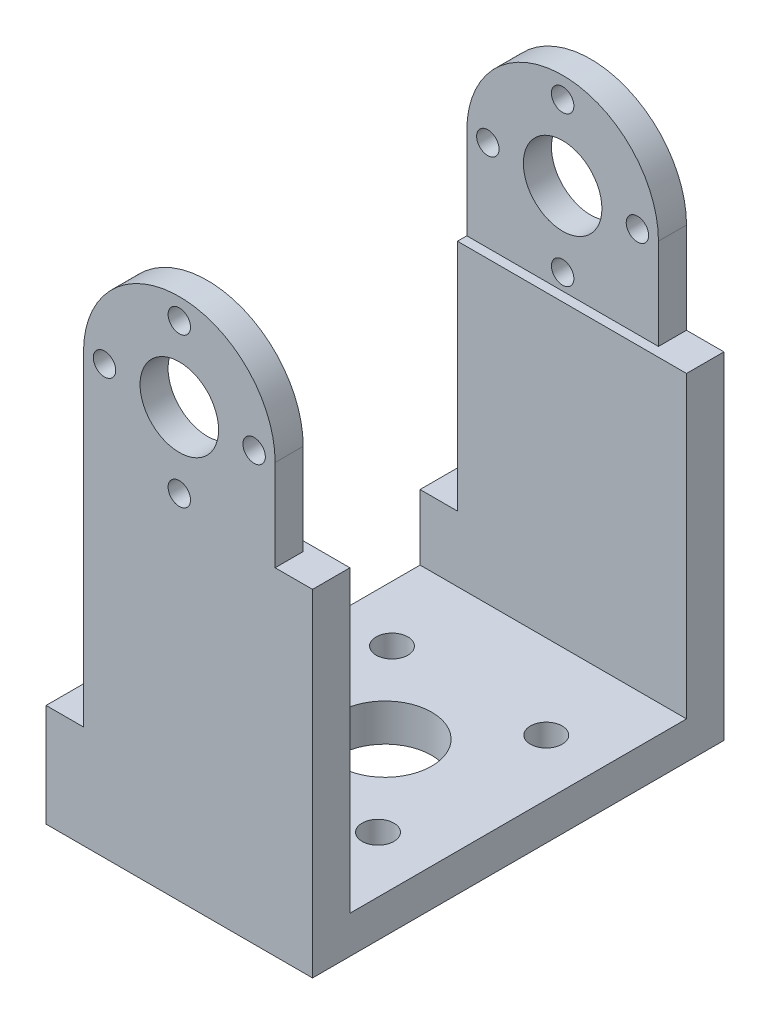
ISO-10303-21;
HEADER;
FILE_DESCRIPTION(('STEP AP214'),'2;1');
FILE_NAME('part.step','',(''),(''),'','','');
FILE_SCHEMA(('AUTOMOTIVE_DESIGN { 1 0 10303 214 1 1 1 1 }'));
ENDSEC;
DATA;
#1=APPLICATION_CONTEXT('core data for automotive mechanical design processes');
#2=APPLICATION_PROTOCOL_DEFINITION('international standard','automotive_design',2000,#1);
#3=PRODUCT_CONTEXT('',#1,'mechanical');
#4=PRODUCT('Part','Part','',(#3));
#5=PRODUCT_RELATED_PRODUCT_CATEGORY('part','',(#4));
#6=PRODUCT_DEFINITION_FORMATION('','',#4);
#7=PRODUCT_DEFINITION_CONTEXT('part definition',#1,'design');
#8=PRODUCT_DEFINITION('design','',#6,#7);
#9=PRODUCT_DEFINITION_SHAPE('','',#8);
#10=(LENGTH_UNIT() NAMED_UNIT(*) SI_UNIT(.MILLI.,.METRE.));
#11=(NAMED_UNIT(*) PLANE_ANGLE_UNIT() SI_UNIT($,.RADIAN.));
#12=(NAMED_UNIT(*) SI_UNIT($,.STERADIAN.) SOLID_ANGLE_UNIT());
#13=UNCERTAINTY_MEASURE_WITH_UNIT(LENGTH_MEASURE(1.E-05),#10,'distance_accuracy_value','');
#14=(GEOMETRIC_REPRESENTATION_CONTEXT(3) GLOBAL_UNCERTAINTY_ASSIGNED_CONTEXT((#13)) GLOBAL_UNIT_ASSIGNED_CONTEXT((#10,
#11,#12)) REPRESENTATION_CONTEXT('',''));
#15=CARTESIAN_POINT('',(0.,0.,0.));
#16=DIRECTION('',(0.,0.,1.));
#17=DIRECTION('',(1.,0.,0.));
#18=AXIS2_PLACEMENT_3D('',#15,#16,#17);
#19=CARTESIAN_POINT('',(10.25,-9.75,-19.));
#20=DIRECTION('',(0.,-1.,0.));
#21=DIRECTION('',(0.,0.,-1.));
#22=AXIS2_PLACEMENT_3D('',#19,#20,#21);
#23=PLANE('',#22);
#24=DIRECTION('',(0.,0.,-1.));
#25=VECTOR('',#24,1.);
#26=CARTESIAN_POINT('',(-10.25,-9.75,22.));
#27=LINE('',#26,#25);
#28=CARTESIAN_POINT('',(-10.25,-9.75000000000001,-18.));
#29=VERTEX_POINT('',#28);
#30=CARTESIAN_POINT('',(-10.25,-9.75,-19.));
#31=VERTEX_POINT('',#30);
#32=EDGE_CURVE('E218',#29,#31,#27,.T.);
#33=ORIENTED_EDGE('',*,*,#32,.F.);
#34=DIRECTION('',(-1.,0.,0.));
#35=VECTOR('',#34,1.);
#36=CARTESIAN_POINT('',(14.25,-9.75000000000001,-18.));
#37=LINE('',#36,#35);
#38=CARTESIAN_POINT('',(14.25,-9.75000000000001,-18.));
#39=VERTEX_POINT('',#38);
#40=EDGE_CURVE('E195',#39,#29,#37,.T.);
#41=ORIENTED_EDGE('',*,*,#40,.F.);
#42=DIRECTION('',(0.,0.,-1.));
#43=VECTOR('',#42,1.);
#44=CARTESIAN_POINT('',(14.25,-9.75,22.));
#45=LINE('',#44,#43);
#46=CARTESIAN_POINT('',(14.25,-9.75,-22.));
#47=VERTEX_POINT('',#46);
#48=EDGE_CURVE('E239',#39,#47,#45,.T.);
#49=ORIENTED_EDGE('',*,*,#48,.T.);
#50=DIRECTION('',(-1.,0.,0.));
#51=VECTOR('',#50,1.);
#52=CARTESIAN_POINT('',(10.25,-9.75,-22.));
#53=LINE('',#52,#51);
#54=CARTESIAN_POINT('',(10.25,-9.75,-22.));
#55=VERTEX_POINT('',#54);
#56=EDGE_CURVE('E182',#47,#55,#53,.T.);
#57=ORIENTED_EDGE('',*,*,#56,.T.);
#58=DIRECTION('',(0.,0.,1.));
#59=VECTOR('',#58,1.);
#60=CARTESIAN_POINT('',(10.25,-9.75,-22.));
#61=LINE('',#60,#59);
#62=CARTESIAN_POINT('',(10.25,-9.75,-19.));
#63=VERTEX_POINT('',#62);
#64=EDGE_CURVE('E448',#55,#63,#61,.T.);
#65=ORIENTED_EDGE('',*,*,#64,.T.);
#66=DIRECTION('',(-1.,0.,0.));
#67=VECTOR('',#66,1.);
#68=CARTESIAN_POINT('',(10.25,-9.75,-19.));
#69=LINE('',#68,#67);
#70=EDGE_CURVE('E405',#63,#31,#69,.T.);
#71=ORIENTED_EDGE('',*,*,#70,.T.);
#72=EDGE_LOOP('',(#33,#41,#49,#57,#65,#71));
#73=FACE_BOUND('',#72,.T.);
#74=ADVANCED_FACE('F47',(#73),#23,.F.);
#75=CARTESIAN_POINT('',(0.,-45.75,0.));
#76=DIRECTION('',(0.,-1.,0.));
#77=DIRECTION('',(0.,0.,-1.));
#78=AXIS2_PLACEMENT_3D('',#75,#76,#77);
#79=PLANE('',#78);
#80=DIRECTION('',(0.,0.,-1.));
#81=VECTOR('',#80,1.);
#82=CARTESIAN_POINT('',(14.25,-45.75,0.));
#83=LINE('',#82,#81);
#84=CARTESIAN_POINT('',(14.25,-45.75,22.));
#85=VERTEX_POINT('',#84);
#86=CARTESIAN_POINT('',(14.25,-45.75,-22.));
#87=VERTEX_POINT('',#86);
#88=EDGE_CURVE('E378',#85,#87,#83,.T.);
#89=ORIENTED_EDGE('',*,*,#88,.F.);
#90=DIRECTION('',(1.,0.,0.));
#91=VECTOR('',#90,1.);
#92=CARTESIAN_POINT('',(-10.25,-45.75,22.));
#93=LINE('',#92,#91);
#94=CARTESIAN_POINT('',(-14.25,-45.75,22.));
#95=VERTEX_POINT('',#94);
#96=EDGE_CURVE('E261',#95,#85,#93,.T.);
#97=ORIENTED_EDGE('',*,*,#96,.F.);
#98=DIRECTION('',(0.,0.,-1.));
#99=VECTOR('',#98,1.);
#100=CARTESIAN_POINT('',(-14.25,-45.75,0.));
#101=LINE('',#100,#99);
#102=CARTESIAN_POINT('',(-14.25,-45.75,-22.));
#103=VERTEX_POINT('',#102);
#104=EDGE_CURVE('E341',#95,#103,#101,.T.);
#105=ORIENTED_EDGE('',*,*,#104,.T.);
#106=DIRECTION('',(-1.,0.,0.));
#107=VECTOR('',#106,1.);
#108=CARTESIAN_POINT('',(10.25,-45.75,-22.));
#109=LINE('',#108,#107);
#110=EDGE_CURVE('E399',#87,#103,#109,.T.);
#111=ORIENTED_EDGE('',*,*,#110,.F.);
#112=EDGE_LOOP('',(#89,#97,#105,#111));
#113=FACE_BOUND('',#112,.T.);
#114=CARTESIAN_POINT('',(-8.24999999999981,-45.75,-8.99999999999999));
#115=DIRECTION('',(0.,-1.,0.));
#116=DIRECTION('',(0.,0.,-1.));
#117=AXIS2_PLACEMENT_3D('',#114,#115,#116);
#118=CIRCLE('',#117,1.7);
#119=CARTESIAN_POINT('',(-8.24999999999981,-45.75,-10.7));
#120=VERTEX_POINT('',#119);
#121=EDGE_CURVE('E330',#120,#120,#118,.T.);
#122=ORIENTED_EDGE('',*,*,#121,.F.);
#123=EDGE_LOOP('',(#122));
#124=FACE_BOUND('',#123,.T.);
#125=CARTESIAN_POINT('',(8.2500000000002,-45.75,-8.99999999999999));
#126=DIRECTION('',(0.,-1.,0.));
#127=DIRECTION('',(0.,0.,-1.));
#128=AXIS2_PLACEMENT_3D('',#125,#126,#127);
#129=CIRCLE('',#128,1.7);
#130=CARTESIAN_POINT('',(8.2500000000002,-45.75,-10.7));
#131=VERTEX_POINT('',#130);
#132=EDGE_CURVE('E362',#131,#131,#129,.T.);
#133=ORIENTED_EDGE('',*,*,#132,.F.);
#134=EDGE_LOOP('',(#133));
#135=FACE_BOUND('',#134,.T.);
#136=CARTESIAN_POINT('',(8.25000000000001,-45.75,9.00000000000001));
#137=DIRECTION('',(0.,-1.,0.));
#138=DIRECTION('',(0.,0.,-1.));
#139=AXIS2_PLACEMENT_3D('',#136,#137,#138);
#140=CIRCLE('',#139,1.7);
#141=CARTESIAN_POINT('',(8.25000000000001,-45.75,7.30000000000001));
#142=VERTEX_POINT('',#141);
#143=EDGE_CURVE('E366',#142,#142,#140,.T.);
#144=ORIENTED_EDGE('',*,*,#143,.F.);
#145=EDGE_LOOP('',(#144));
#146=FACE_BOUND('',#145,.T.);
#147=CARTESIAN_POINT('',(-8.24999999999999,-45.75,9.00000000000001));
#148=DIRECTION('',(0.,-1.,0.));
#149=DIRECTION('',(0.,0.,-1.));
#150=AXIS2_PLACEMENT_3D('',#147,#148,#149);
#151=CIRCLE('',#150,1.7);
#152=CARTESIAN_POINT('',(-8.24999999999999,-45.75,7.30000000000001));
#153=VERTEX_POINT('',#152);
#154=EDGE_CURVE('E370',#153,#153,#151,.T.);
#155=ORIENTED_EDGE('',*,*,#154,.F.);
#156=EDGE_LOOP('',(#155));
#157=FACE_BOUND('',#156,.T.);
#158=CARTESIAN_POINT('',(0.,-45.75,0.));
#159=DIRECTION('',(0.,-1.,0.));
#160=DIRECTION('',(0.,0.,-1.));
#161=AXIS2_PLACEMENT_3D('',#158,#159,#160);
#162=CIRCLE('',#161,5.);
#163=CARTESIAN_POINT('',(0.,-45.75,-5.));
#164=VERTEX_POINT('',#163);
#165=EDGE_CURVE('E374',#164,#164,#162,.T.);
#166=ORIENTED_EDGE('',*,*,#165,.F.);
#167=EDGE_LOOP('',(#166));
#168=FACE_BOUND('',#167,.T.);
#169=ADVANCED_FACE('F49',(#113,#124,#135,#146,#157,#168),#79,.T.);
#170=CARTESIAN_POINT('',(-10.25,0.,-22.));
#171=DIRECTION('',(-1.,0.,0.));
#172=DIRECTION('',(0.,0.,1.));
#173=AXIS2_PLACEMENT_3D('',#170,#171,#172);
#174=PLANE('',#173);
#175=DIRECTION('',(0.,-1.,0.));
#176=VECTOR('',#175,1.);
#177=CARTESIAN_POINT('',(-10.25,0.,-18.));
#178=LINE('',#177,#176);
#179=CARTESIAN_POINT('',(-10.25,-34.75,-18.));
#180=VERTEX_POINT('',#179);
#181=EDGE_CURVE('E70',#29,#180,#178,.T.);
#182=ORIENTED_EDGE('',*,*,#181,.F.);
#183=ORIENTED_EDGE('',*,*,#32,.T.);
#184=DIRECTION('',(0.,-1.,0.));
#185=VECTOR('',#184,1.);
#186=CARTESIAN_POINT('',(-10.25,10.25,-19.));
#187=LINE('',#186,#185);
#188=CARTESIAN_POINT('',(-10.25,0.,-19.));
#189=VERTEX_POINT('',#188);
#190=EDGE_CURVE('E429',#189,#31,#187,.T.);
#191=ORIENTED_EDGE('',*,*,#190,.F.);
#192=DIRECTION('',(0.,0.,1.));
#193=VECTOR('',#192,1.);
#194=CARTESIAN_POINT('',(-10.25,0.,-22.));
#195=LINE('',#194,#193);
#196=CARTESIAN_POINT('',(-10.25,0.,-22.));
#197=VERTEX_POINT('',#196);
#198=EDGE_CURVE('E409',#197,#189,#195,.T.);
#199=ORIENTED_EDGE('',*,*,#198,.F.);
#200=DIRECTION('',(0.,-1.,0.));
#201=VECTOR('',#200,1.);
#202=CARTESIAN_POINT('',(-10.25,0.,-22.));
#203=LINE('',#202,#201);
#204=CARTESIAN_POINT('',(-10.25,-34.75,-22.));
#205=VERTEX_POINT('',#204);
#206=EDGE_CURVE('E400',#197,#205,#203,.T.);
#207=ORIENTED_EDGE('',*,*,#206,.T.);
#208=DIRECTION('',(0.,0.,-1.));
#209=VECTOR('',#208,1.);
#210=CARTESIAN_POINT('',(-10.25,-34.75,22.));
#211=LINE('',#210,#209);
#212=EDGE_CURVE('E230',#180,#205,#211,.T.);
#213=ORIENTED_EDGE('',*,*,#212,.F.);
#214=EDGE_LOOP('',(#182,#183,#191,#199,#207,#213));
#215=FACE_BOUND('',#214,.T.);
#216=ADVANCED_FACE('F473',(#215),#174,.T.);
#217=CARTESIAN_POINT('',(0.,0.,-22.));
#218=DIRECTION('',(0.,0.,1.));
#219=DIRECTION('',(1.,0.,0.));
#220=AXIS2_PLACEMENT_3D('',#217,#218,#219);
#221=CYLINDRICAL_SURFACE('',#220,10.25);
#222=CARTESIAN_POINT('',(0.,0.,-19.));
#223=DIRECTION('',(0.,0.,-1.));
#224=DIRECTION('',(-1.,0.,0.));
#225=AXIS2_PLACEMENT_3D('',#222,#223,#224);
#226=CIRCLE('',#225,10.25);
#227=CARTESIAN_POINT('',(10.25,0.,-19.));
#228=VERTEX_POINT('',#227);
#229=EDGE_CURVE('E394',#228,#189,#226,.F.);
#230=ORIENTED_EDGE('',*,*,#229,.F.);
#231=DIRECTION('',(0.,0.,1.));
#232=VECTOR('',#231,1.);
#233=CARTESIAN_POINT('',(10.25,0.,-22.));
#234=LINE('',#233,#232);
#235=CARTESIAN_POINT('',(10.25,0.,-22.));
#236=VERTEX_POINT('',#235);
#237=EDGE_CURVE('E426',#236,#228,#234,.T.);
#238=ORIENTED_EDGE('',*,*,#237,.F.);
#239=CARTESIAN_POINT('',(0.,0.,-22.));
#240=DIRECTION('',(0.,0.,1.));
#241=DIRECTION('',(1.,0.,0.));
#242=AXIS2_PLACEMENT_3D('',#239,#240,#241);
#243=CIRCLE('',#242,10.25);
#244=EDGE_CURVE('E404',#236,#197,#243,.T.);
#245=ORIENTED_EDGE('',*,*,#244,.T.);
#246=ORIENTED_EDGE('',*,*,#198,.T.);
#247=EDGE_LOOP('',(#230,#238,#245,#246));
#248=FACE_BOUND('',#247,.T.);
#249=ADVANCED_FACE('F537',(#248),#221,.T.);
#250=CARTESIAN_POINT('',(0.,0.,-22.));
#251=DIRECTION('',(0.,0.,1.));
#252=DIRECTION('',(1.,0.,0.));
#253=AXIS2_PLACEMENT_3D('',#250,#251,#252);
#254=CYLINDRICAL_SURFACE('',#253,4.2);
#255=CARTESIAN_POINT('',(0.,0.,-19.));
#256=DIRECTION('',(0.,0.,-1.));
#257=DIRECTION('',(-1.,0.,0.));
#258=AXIS2_PLACEMENT_3D('',#255,#256,#257);
#259=CIRCLE('',#258,4.2);
#260=CARTESIAN_POINT('',(-4.2,0.,-19.));
#261=VERTEX_POINT('',#260);
#262=EDGE_CURVE('E430',#261,#261,#259,.F.);
#263=ORIENTED_EDGE('',*,*,#262,.T.);
#264=EDGE_LOOP('',(#263));
#265=FACE_BOUND('',#264,.T.);
#266=CARTESIAN_POINT('',(0.,0.,-22.));
#267=DIRECTION('',(0.,0.,1.));
#268=DIRECTION('',(1.,0.,0.));
#269=AXIS2_PLACEMENT_3D('',#266,#267,#268);
#270=CIRCLE('',#269,4.2);
#271=CARTESIAN_POINT('',(4.2,0.,-22.));
#272=VERTEX_POINT('',#271);
#273=EDGE_CURVE('E410',#272,#272,#270,.T.);
#274=ORIENTED_EDGE('',*,*,#273,.F.);
#275=EDGE_LOOP('',(#274));
#276=FACE_BOUND('',#275,.T.);
#277=ADVANCED_FACE('F568',(#265,#276),#254,.F.);
#278=CARTESIAN_POINT('',(8.,0.,-22.));
#279=DIRECTION('',(0.,0.,1.));
#280=DIRECTION('',(1.,0.,0.));
#281=AXIS2_PLACEMENT_3D('',#278,#279,#280);
#282=CYLINDRICAL_SURFACE('',#281,1.2);
#283=CARTESIAN_POINT('',(8.,0.,-19.));
#284=DIRECTION('',(0.,0.,-1.));
#285=DIRECTION('',(-1.,0.,0.));
#286=AXIS2_PLACEMENT_3D('',#283,#284,#285);
#287=CIRCLE('',#286,1.2);
#288=CARTESIAN_POINT('',(6.8,0.,-19.));
#289=VERTEX_POINT('',#288);
#290=EDGE_CURVE('E434',#289,#289,#287,.F.);
#291=ORIENTED_EDGE('',*,*,#290,.T.);
#292=EDGE_LOOP('',(#291));
#293=FACE_BOUND('',#292,.T.);
#294=CARTESIAN_POINT('',(8.,0.,-22.));
#295=DIRECTION('',(0.,0.,1.));
#296=DIRECTION('',(1.,0.,0.));
#297=AXIS2_PLACEMENT_3D('',#294,#295,#296);
#298=CIRCLE('',#297,1.2);
#299=CARTESIAN_POINT('',(9.2,0.,-22.));
#300=VERTEX_POINT('',#299);
#301=EDGE_CURVE('E414',#300,#300,#298,.T.);
#302=ORIENTED_EDGE('',*,*,#301,.F.);
#303=EDGE_LOOP('',(#302));
#304=FACE_BOUND('',#303,.T.);
#305=ADVANCED_FACE('F577',(#293,#304),#282,.F.);
#306=CARTESIAN_POINT('',(0.,8.,-22.));
#307=DIRECTION('',(0.,0.,1.));
#308=DIRECTION('',(1.,0.,0.));
#309=AXIS2_PLACEMENT_3D('',#306,#307,#308);
#310=CYLINDRICAL_SURFACE('',#309,1.2);
#311=CARTESIAN_POINT('',(0.,8.,-19.));
#312=DIRECTION('',(0.,0.,-1.));
#313=DIRECTION('',(-1.,0.,0.));
#314=AXIS2_PLACEMENT_3D('',#311,#312,#313);
#315=CIRCLE('',#314,1.2);
#316=CARTESIAN_POINT('',(-1.2,8.,-19.));
#317=VERTEX_POINT('',#316);
#318=EDGE_CURVE('E438',#317,#317,#315,.F.);
#319=ORIENTED_EDGE('',*,*,#318,.T.);
#320=EDGE_LOOP('',(#319));
#321=FACE_BOUND('',#320,.T.);
#322=CARTESIAN_POINT('',(0.,8.,-22.));
#323=DIRECTION('',(0.,0.,1.));
#324=DIRECTION('',(1.,0.,0.));
#325=AXIS2_PLACEMENT_3D('',#322,#323,#324);
#326=CIRCLE('',#325,1.2);
#327=CARTESIAN_POINT('',(1.2,8.,-22.));
#328=VERTEX_POINT('',#327);
#329=EDGE_CURVE('E418',#328,#328,#326,.T.);
#330=ORIENTED_EDGE('',*,*,#329,.F.);
#331=EDGE_LOOP('',(#330));
#332=FACE_BOUND('',#331,.T.);
#333=ADVANCED_FACE('F573',(#321,#332),#310,.F.);
#334=CARTESIAN_POINT('',(-8.,0.,-22.));
#335=DIRECTION('',(0.,0.,1.));
#336=DIRECTION('',(1.,0.,0.));
#337=AXIS2_PLACEMENT_3D('',#334,#335,#336);
#338=CYLINDRICAL_SURFACE('',#337,1.2);
#339=CARTESIAN_POINT('',(-8.,0.,-19.));
#340=DIRECTION('',(0.,0.,-1.));
#341=DIRECTION('',(-1.,0.,0.));
#342=AXIS2_PLACEMENT_3D('',#339,#340,#341);
#343=CIRCLE('',#342,1.2);
#344=CARTESIAN_POINT('',(-9.2,0.,-19.));
#345=VERTEX_POINT('',#344);
#346=EDGE_CURVE('E389',#345,#345,#343,.F.);
#347=ORIENTED_EDGE('',*,*,#346,.T.);
#348=EDGE_LOOP('',(#347));
#349=FACE_BOUND('',#348,.T.);
#350=CARTESIAN_POINT('',(-8.,0.,-22.));
#351=DIRECTION('',(0.,0.,1.));
#352=DIRECTION('',(1.,0.,0.));
#353=AXIS2_PLACEMENT_3D('',#350,#351,#352);
#354=CIRCLE('',#353,1.2);
#355=CARTESIAN_POINT('',(-6.8,0.,-22.));
#356=VERTEX_POINT('',#355);
#357=EDGE_CURVE('E422',#356,#356,#354,.T.);
#358=ORIENTED_EDGE('',*,*,#357,.F.);
#359=EDGE_LOOP('',(#358));
#360=FACE_BOUND('',#359,.T.);
#361=ADVANCED_FACE('F570',(#349,#360),#338,.F.);
#362=CARTESIAN_POINT('',(0.,-8.,-22.));
#363=DIRECTION('',(0.,0.,1.));
#364=DIRECTION('',(1.,0.,0.));
#365=AXIS2_PLACEMENT_3D('',#362,#363,#364);
#366=CYLINDRICAL_SURFACE('',#365,1.2);
#367=CARTESIAN_POINT('',(0.,-8.,-19.));
#368=DIRECTION('',(0.,0.,-1.));
#369=DIRECTION('',(-1.,0.,0.));
#370=AXIS2_PLACEMENT_3D('',#367,#368,#369);
#371=CIRCLE('',#370,1.2);
#372=CARTESIAN_POINT('',(-1.20000000000006,-8.,-19.));
#373=VERTEX_POINT('',#372);
#374=EDGE_CURVE('E384',#373,#373,#371,.F.);
#375=ORIENTED_EDGE('',*,*,#374,.T.);
#376=EDGE_LOOP('',(#375));
#377=FACE_BOUND('',#376,.T.);
#378=CARTESIAN_POINT('',(0.,-8.,-22.));
#379=DIRECTION('',(0.,0.,1.));
#380=DIRECTION('',(1.,0.,0.));
#381=AXIS2_PLACEMENT_3D('',#378,#379,#380);
#382=CIRCLE('',#381,1.2);
#383=CARTESIAN_POINT('',(1.19999999999994,-8.,-22.));
#384=VERTEX_POINT('',#383);
#385=EDGE_CURVE('E390',#384,#384,#382,.T.);
#386=ORIENTED_EDGE('',*,*,#385,.F.);
#387=EDGE_LOOP('',(#386));
#388=FACE_BOUND('',#387,.T.);
#389=ADVANCED_FACE('F565',(#377,#388),#366,.F.);
#390=CARTESIAN_POINT('',(10.25,0.,-22.));
#391=DIRECTION('',(-1.,0.,0.));
#392=DIRECTION('',(0.,0.,1.));
#393=AXIS2_PLACEMENT_3D('',#390,#391,#392);
#394=PLANE('',#393);
#395=DIRECTION('',(0.,-1.,0.));
#396=VECTOR('',#395,1.);
#397=CARTESIAN_POINT('',(10.25,10.25,-19.));
#398=LINE('',#397,#396);
#399=EDGE_CURVE('E388',#228,#63,#398,.T.);
#400=ORIENTED_EDGE('',*,*,#399,.T.);
#401=ORIENTED_EDGE('',*,*,#64,.F.);
#402=DIRECTION('',(0.,-1.,0.));
#403=VECTOR('',#402,1.);
#404=CARTESIAN_POINT('',(10.25,0.,-22.));
#405=LINE('',#404,#403);
#406=EDGE_CURVE('E395',#236,#55,#405,.T.);
#407=ORIENTED_EDGE('',*,*,#406,.F.);
#408=ORIENTED_EDGE('',*,*,#237,.T.);
#409=EDGE_LOOP('',(#400,#401,#407,#408));
#410=FACE_BOUND('',#409,.T.);
#411=ADVANCED_FACE('F530',(#410),#394,.F.);
#412=CARTESIAN_POINT('',(0.,0.,-22.));
#413=DIRECTION('',(0.,0.,1.));
#414=DIRECTION('',(1.,0.,0.));
#415=AXIS2_PLACEMENT_3D('',#412,#413,#414);
#416=PLANE('',#415);
#417=ORIENTED_EDGE('',*,*,#357,.T.);
#418=EDGE_LOOP('',(#417));
#419=FACE_BOUND('',#418,.T.);
#420=ORIENTED_EDGE('',*,*,#329,.T.);
#421=EDGE_LOOP('',(#420));
#422=FACE_BOUND('',#421,.T.);
#423=ORIENTED_EDGE('',*,*,#301,.T.);
#424=EDGE_LOOP('',(#423));
#425=FACE_BOUND('',#424,.T.);
#426=ORIENTED_EDGE('',*,*,#273,.T.);
#427=EDGE_LOOP('',(#426));
#428=FACE_BOUND('',#427,.T.);
#429=DIRECTION('',(0.,-1.,0.));
#430=VECTOR('',#429,1.);
#431=CARTESIAN_POINT('',(-14.25,-9.75,-22.));
#432=LINE('',#431,#430);
#433=CARTESIAN_POINT('',(-14.25,-34.75,-22.));
#434=VERTEX_POINT('',#433);
#435=EDGE_CURVE('E244',#434,#103,#432,.T.);
#436=ORIENTED_EDGE('',*,*,#435,.F.);
#437=DIRECTION('',(-1.,0.,0.));
#438=VECTOR('',#437,1.);
#439=CARTESIAN_POINT('',(-10.25,-34.75,-22.));
#440=LINE('',#439,#438);
#441=EDGE_CURVE('E213',#205,#434,#440,.T.);
#442=ORIENTED_EDGE('',*,*,#441,.F.);
#443=ORIENTED_EDGE('',*,*,#206,.F.);
#444=ORIENTED_EDGE('',*,*,#244,.F.);
#445=ORIENTED_EDGE('',*,*,#406,.T.);
#446=ORIENTED_EDGE('',*,*,#56,.F.);
#447=DIRECTION('',(0.,1.,0.));
#448=VECTOR('',#447,1.);
#449=CARTESIAN_POINT('',(14.25,-9.75,-22.));
#450=LINE('',#449,#448);
#451=EDGE_CURVE('E240',#87,#47,#450,.T.);
#452=ORIENTED_EDGE('',*,*,#451,.F.);
#453=ORIENTED_EDGE('',*,*,#110,.T.);
#454=EDGE_LOOP('',(#436,#442,#443,#444,#445,#446,#452,#453));
#455=FACE_BOUND('',#454,.T.);
#456=ORIENTED_EDGE('',*,*,#385,.T.);
#457=EDGE_LOOP('',(#456));
#458=FACE_BOUND('',#457,.T.);
#459=ADVANCED_FACE('F522',(#419,#422,#425,#428,#455,#458),#416,.F.);
#460=CARTESIAN_POINT('',(10.25,10.25,-19.));
#461=DIRECTION('',(0.,0.,-1.));
#462=DIRECTION('',(-1.,0.,0.));
#463=AXIS2_PLACEMENT_3D('',#460,#461,#462);
#464=PLANE('',#463);
#465=ORIENTED_EDGE('',*,*,#229,.T.);
#466=ORIENTED_EDGE('',*,*,#190,.T.);
#467=ORIENTED_EDGE('',*,*,#70,.F.);
#468=ORIENTED_EDGE('',*,*,#399,.F.);
#469=EDGE_LOOP('',(#465,#466,#467,#468));
#470=FACE_BOUND('',#469,.T.);
#471=ORIENTED_EDGE('',*,*,#290,.F.);
#472=EDGE_LOOP('',(#471));
#473=FACE_BOUND('',#472,.T.);
#474=ORIENTED_EDGE('',*,*,#346,.F.);
#475=EDGE_LOOP('',(#474));
#476=FACE_BOUND('',#475,.T.);
#477=ORIENTED_EDGE('',*,*,#374,.F.);
#478=EDGE_LOOP('',(#477));
#479=FACE_BOUND('',#478,.T.);
#480=ORIENTED_EDGE('',*,*,#318,.F.);
#481=EDGE_LOOP('',(#480));
#482=FACE_BOUND('',#481,.T.);
#483=ORIENTED_EDGE('',*,*,#262,.F.);
#484=EDGE_LOOP('',(#483));
#485=FACE_BOUND('',#484,.T.);
#486=ADVANCED_FACE('F533',(#470,#473,#476,#479,#482,#485),#464,.F.);
#487=CARTESIAN_POINT('',(14.25,-41.75,0.));
#488=DIRECTION('',(-1.,0.,0.));
#489=DIRECTION('',(0.,0.,1.));
#490=AXIS2_PLACEMENT_3D('',#487,#488,#489);
#491=PLANE('',#490);
#492=DIRECTION('',(0.,0.,-1.));
#493=VECTOR('',#492,1.);
#494=CARTESIAN_POINT('',(14.25,-41.75,0.));
#495=LINE('',#494,#493);
#496=CARTESIAN_POINT('',(14.25,-41.75,18.));
#497=VERTEX_POINT('',#496);
#498=CARTESIAN_POINT('',(14.25,-41.75,-18.));
#499=VERTEX_POINT('',#498);
#500=EDGE_CURVE('E183',#497,#499,#495,.T.);
#501=ORIENTED_EDGE('',*,*,#500,.F.);
#502=DIRECTION('',(0.,1.,0.));
#503=VECTOR('',#502,1.);
#504=CARTESIAN_POINT('',(14.25,-9.75,18.));
#505=LINE('',#504,#503);
#506=CARTESIAN_POINT('',(14.25,-9.75,18.));
#507=VERTEX_POINT('',#506);
#508=EDGE_CURVE('E190',#497,#507,#505,.T.);
#509=ORIENTED_EDGE('',*,*,#508,.T.);
#510=CARTESIAN_POINT('',(14.25,-9.75,22.));
#511=VERTEX_POINT('',#510);
#512=EDGE_CURVE('E245',#511,#507,#45,.T.);
#513=ORIENTED_EDGE('',*,*,#512,.F.);
#514=DIRECTION('',(0.,1.,0.));
#515=VECTOR('',#514,1.);
#516=CARTESIAN_POINT('',(14.25,-9.75,22.));
#517=LINE('',#516,#515);
#518=EDGE_CURVE('E235',#85,#511,#517,.T.);
#519=ORIENTED_EDGE('',*,*,#518,.F.);
#520=ORIENTED_EDGE('',*,*,#88,.T.);
#521=ORIENTED_EDGE('',*,*,#451,.T.);
#522=ORIENTED_EDGE('',*,*,#48,.F.);
#523=DIRECTION('',(0.,-1.,0.));
#524=VECTOR('',#523,1.);
#525=CARTESIAN_POINT('',(14.25,-9.75000000000001,-18.));
#526=LINE('',#525,#524);
#527=EDGE_CURVE('E207',#39,#499,#526,.T.);
#528=ORIENTED_EDGE('',*,*,#527,.T.);
#529=EDGE_LOOP('',(#501,#509,#513,#519,#520,#521,#522,#528));
#530=FACE_BOUND('',#529,.T.);
#531=ADVANCED_FACE('F509',(#530),#491,.F.);
#532=CARTESIAN_POINT('',(-14.25,-41.75,0.));
#533=DIRECTION('',(-1.,0.,0.));
#534=DIRECTION('',(0.,0.,1.));
#535=AXIS2_PLACEMENT_3D('',#532,#533,#534);
#536=PLANE('',#535);
#537=DIRECTION('',(0.,1.,0.));
#538=VECTOR('',#537,1.);
#539=CARTESIAN_POINT('',(-14.25,-9.75,18.));
#540=LINE('',#539,#538);
#541=CARTESIAN_POINT('',(-14.25,-41.75,18.));
#542=VERTEX_POINT('',#541);
#543=CARTESIAN_POINT('',(-14.25,-34.75,18.));
#544=VERTEX_POINT('',#543);
#545=EDGE_CURVE('E63',#542,#544,#540,.T.);
#546=ORIENTED_EDGE('',*,*,#545,.F.);
#547=DIRECTION('',(0.,0.,-1.));
#548=VECTOR('',#547,1.);
#549=CARTESIAN_POINT('',(-14.25,-41.75,0.));
#550=LINE('',#549,#548);
#551=CARTESIAN_POINT('',(-14.25,-41.75,-18.));
#552=VERTEX_POINT('',#551);
#553=EDGE_CURVE('E172',#542,#552,#550,.T.);
#554=ORIENTED_EDGE('',*,*,#553,.T.);
#555=DIRECTION('',(0.,-1.,0.));
#556=VECTOR('',#555,1.);
#557=CARTESIAN_POINT('',(-14.25,-9.75000000000001,-18.));
#558=LINE('',#557,#556);
#559=CARTESIAN_POINT('',(-14.25,-34.75,-18.));
#560=VERTEX_POINT('',#559);
#561=EDGE_CURVE('E175',#560,#552,#558,.T.);
#562=ORIENTED_EDGE('',*,*,#561,.F.);
#563=DIRECTION('',(0.,0.,-1.));
#564=VECTOR('',#563,1.);
#565=CARTESIAN_POINT('',(-14.25,-34.75,22.));
#566=LINE('',#565,#564);
#567=EDGE_CURVE('E229',#560,#434,#566,.T.);
#568=ORIENTED_EDGE('',*,*,#567,.T.);
#569=ORIENTED_EDGE('',*,*,#435,.T.);
#570=ORIENTED_EDGE('',*,*,#104,.F.);
#571=DIRECTION('',(0.,-1.,0.));
#572=VECTOR('',#571,1.);
#573=CARTESIAN_POINT('',(-14.25,-9.75,22.));
#574=LINE('',#573,#572);
#575=CARTESIAN_POINT('',(-14.25,-34.75,22.));
#576=VERTEX_POINT('',#575);
#577=EDGE_CURVE('E234',#576,#95,#574,.T.);
#578=ORIENTED_EDGE('',*,*,#577,.F.);
#579=EDGE_CURVE('E231',#576,#544,#566,.T.);
#580=ORIENTED_EDGE('',*,*,#579,.T.);
#581=EDGE_LOOP('',(#546,#554,#562,#568,#569,#570,#578,#580));
#582=FACE_BOUND('',#581,.T.);
#583=ADVANCED_FACE('F174',(#582),#536,.T.);
#584=CARTESIAN_POINT('',(0.,-41.75,0.));
#585=DIRECTION('',(0.,-1.,0.));
#586=DIRECTION('',(0.,0.,-1.));
#587=AXIS2_PLACEMENT_3D('',#584,#585,#586);
#588=CYLINDRICAL_SURFACE('',#587,5.);
#589=CARTESIAN_POINT('',(0.,-41.75,0.));
#590=DIRECTION('',(0.,-1.,0.));
#591=DIRECTION('',(0.,0.,-1.));
#592=AXIS2_PLACEMENT_3D('',#589,#590,#591);
#593=CIRCLE('',#592,5.);
#594=CARTESIAN_POINT('',(0.,-41.75,-5.));
#595=VERTEX_POINT('',#594);
#596=EDGE_CURVE('E353',#595,#595,#593,.T.);
#597=ORIENTED_EDGE('',*,*,#596,.F.);
#598=EDGE_LOOP('',(#597));
#599=FACE_BOUND('',#598,.T.);
#600=ORIENTED_EDGE('',*,*,#165,.T.);
#601=EDGE_LOOP('',(#600));
#602=FACE_BOUND('',#601,.T.);
#603=ADVANCED_FACE('F608',(#599,#602),#588,.F.);
#604=CARTESIAN_POINT('',(-8.24999999999999,-41.75,9.00000000000001));
#605=DIRECTION('',(0.,-1.,0.));
#606=DIRECTION('',(0.,0.,-1.));
#607=AXIS2_PLACEMENT_3D('',#604,#605,#606);
#608=CYLINDRICAL_SURFACE('',#607,1.7);
#609=CARTESIAN_POINT('',(-8.24999999999999,-41.75,9.00000000000001));
#610=DIRECTION('',(0.,-1.,0.));
#611=DIRECTION('',(0.,0.,-1.));
#612=AXIS2_PLACEMENT_3D('',#609,#610,#611);
#613=CIRCLE('',#612,1.7);
#614=CARTESIAN_POINT('',(-8.24999999999999,-41.75,7.30000000000001));
#615=VERTEX_POINT('',#614);
#616=EDGE_CURVE('E349',#615,#615,#613,.T.);
#617=ORIENTED_EDGE('',*,*,#616,.F.);
#618=EDGE_LOOP('',(#617));
#619=FACE_BOUND('',#618,.T.);
#620=ORIENTED_EDGE('',*,*,#154,.T.);
#621=EDGE_LOOP('',(#620));
#622=FACE_BOUND('',#621,.T.);
#623=ADVANCED_FACE('F604',(#619,#622),#608,.F.);
#624=CARTESIAN_POINT('',(8.25000000000001,-41.75,9.00000000000001));
#625=DIRECTION('',(0.,-1.,0.));
#626=DIRECTION('',(0.,0.,-1.));
#627=AXIS2_PLACEMENT_3D('',#624,#625,#626);
#628=CYLINDRICAL_SURFACE('',#627,1.7);
#629=CARTESIAN_POINT('',(8.25000000000001,-41.75,9.00000000000001));
#630=DIRECTION('',(0.,-1.,0.));
#631=DIRECTION('',(0.,0.,-1.));
#632=AXIS2_PLACEMENT_3D('',#629,#630,#631);
#633=CIRCLE('',#632,1.7);
#634=CARTESIAN_POINT('',(8.25000000000001,-41.75,7.30000000000001));
#635=VERTEX_POINT('',#634);
#636=EDGE_CURVE('E345',#635,#635,#633,.T.);
#637=ORIENTED_EDGE('',*,*,#636,.F.);
#638=EDGE_LOOP('',(#637));
#639=FACE_BOUND('',#638,.T.);
#640=ORIENTED_EDGE('',*,*,#143,.T.);
#641=EDGE_LOOP('',(#640));
#642=FACE_BOUND('',#641,.T.);
#643=ADVANCED_FACE('F600',(#639,#642),#628,.F.);
#644=CARTESIAN_POINT('',(8.2500000000002,-41.75,-8.99999999999999));
#645=DIRECTION('',(0.,-1.,0.));
#646=DIRECTION('',(0.,0.,-1.));
#647=AXIS2_PLACEMENT_3D('',#644,#645,#646);
#648=CYLINDRICAL_SURFACE('',#647,1.7);
#649=CARTESIAN_POINT('',(8.2500000000002,-41.75,-8.99999999999999));
#650=DIRECTION('',(0.,-1.,0.));
#651=DIRECTION('',(0.,0.,-1.));
#652=AXIS2_PLACEMENT_3D('',#649,#650,#651);
#653=CIRCLE('',#652,1.7);
#654=CARTESIAN_POINT('',(8.2500000000002,-41.75,-10.7));
#655=VERTEX_POINT('',#654);
#656=EDGE_CURVE('E340',#655,#655,#653,.T.);
#657=ORIENTED_EDGE('',*,*,#656,.F.);
#658=EDGE_LOOP('',(#657));
#659=FACE_BOUND('',#658,.T.);
#660=ORIENTED_EDGE('',*,*,#132,.T.);
#661=EDGE_LOOP('',(#660));
#662=FACE_BOUND('',#661,.T.);
#663=ADVANCED_FACE('F596',(#659,#662),#648,.F.);
#664=CARTESIAN_POINT('',(-8.24999999999981,-41.75,-8.99999999999999));
#665=DIRECTION('',(0.,-1.,0.));
#666=DIRECTION('',(0.,0.,-1.));
#667=AXIS2_PLACEMENT_3D('',#664,#665,#666);
#668=CYLINDRICAL_SURFACE('',#667,1.7);
#669=CARTESIAN_POINT('',(-8.24999999999981,-41.75,-8.99999999999999));
#670=DIRECTION('',(0.,-1.,0.));
#671=DIRECTION('',(0.,0.,-1.));
#672=AXIS2_PLACEMENT_3D('',#669,#670,#671);
#673=CIRCLE('',#672,1.7);
#674=CARTESIAN_POINT('',(-8.24999999999981,-41.75,-10.7));
#675=VERTEX_POINT('',#674);
#676=EDGE_CURVE('E336',#675,#675,#673,.T.);
#677=ORIENTED_EDGE('',*,*,#676,.F.);
#678=EDGE_LOOP('',(#677));
#679=FACE_BOUND('',#678,.T.);
#680=ORIENTED_EDGE('',*,*,#121,.T.);
#681=EDGE_LOOP('',(#680));
#682=FACE_BOUND('',#681,.T.);
#683=ADVANCED_FACE('F593',(#679,#682),#668,.F.);
#684=CARTESIAN_POINT('',(0.,-41.75,0.));
#685=DIRECTION('',(0.,-1.,0.));
#686=DIRECTION('',(0.,0.,-1.));
#687=AXIS2_PLACEMENT_3D('',#684,#685,#686);
#688=PLANE('',#687);
#689=ORIENTED_EDGE('',*,*,#676,.T.);
#690=EDGE_LOOP('',(#689));
#691=FACE_BOUND('',#690,.T.);
#692=ORIENTED_EDGE('',*,*,#656,.T.);
#693=EDGE_LOOP('',(#692));
#694=FACE_BOUND('',#693,.T.);
#695=ORIENTED_EDGE('',*,*,#636,.T.);
#696=EDGE_LOOP('',(#695));
#697=FACE_BOUND('',#696,.T.);
#698=ORIENTED_EDGE('',*,*,#616,.T.);
#699=EDGE_LOOP('',(#698));
#700=FACE_BOUND('',#699,.T.);
#701=ORIENTED_EDGE('',*,*,#596,.T.);
#702=EDGE_LOOP('',(#701));
#703=FACE_BOUND('',#702,.T.);
#704=ORIENTED_EDGE('',*,*,#500,.T.);
#705=DIRECTION('',(-1.,0.,0.));
#706=VECTOR('',#705,1.);
#707=CARTESIAN_POINT('',(14.25,-41.75,-18.));
#708=LINE('',#707,#706);
#709=EDGE_CURVE('E187',#499,#552,#708,.T.);
#710=ORIENTED_EDGE('',*,*,#709,.T.);
#711=ORIENTED_EDGE('',*,*,#553,.F.);
#712=DIRECTION('',(-1.,0.,0.));
#713=VECTOR('',#712,1.);
#714=CARTESIAN_POINT('',(14.25,-41.75,18.));
#715=LINE('',#714,#713);
#716=EDGE_CURVE('E194',#497,#542,#715,.T.);
#717=ORIENTED_EDGE('',*,*,#716,.F.);
#718=EDGE_LOOP('',(#704,#710,#711,#717));
#719=FACE_BOUND('',#718,.T.);
#720=ADVANCED_FACE('F192',(#691,#694,#697,#700,#703,#719),#688,.F.);
#721=CARTESIAN_POINT('',(10.25,10.25,19.));
#722=DIRECTION('',(0.,0.,1.));
#723=DIRECTION('',(0.,-1.,0.));
#724=AXIS2_PLACEMENT_3D('',#721,#722,#723);
#725=PLANE('',#724);
#726=CARTESIAN_POINT('',(0.,0.,19.));
#727=DIRECTION('',(0.,0.,1.));
#728=DIRECTION('',(0.,-1.,0.));
#729=AXIS2_PLACEMENT_3D('',#726,#727,#728);
#730=CIRCLE('',#729,10.25);
#731=CARTESIAN_POINT('',(-10.25,0.,19.));
#732=VERTEX_POINT('',#731);
#733=CARTESIAN_POINT('',(10.25,0.,19.));
#734=VERTEX_POINT('',#733);
#735=EDGE_CURVE('E293',#732,#734,#730,.F.);
#736=ORIENTED_EDGE('',*,*,#735,.T.);
#737=DIRECTION('',(0.,1.,0.));
#738=VECTOR('',#737,1.);
#739=CARTESIAN_POINT('',(10.25,10.25,19.));
#740=LINE('',#739,#738);
#741=CARTESIAN_POINT('',(10.25,-9.75,19.));
#742=VERTEX_POINT('',#741);
#743=EDGE_CURVE('E266',#742,#734,#740,.T.);
#744=ORIENTED_EDGE('',*,*,#743,.F.);
#745=DIRECTION('',(-1.,0.,0.));
#746=VECTOR('',#745,1.);
#747=CARTESIAN_POINT('',(10.25,-9.75,19.));
#748=LINE('',#747,#746);
#749=CARTESIAN_POINT('',(-10.25,-9.75,19.));
#750=VERTEX_POINT('',#749);
#751=EDGE_CURVE('E270',#742,#750,#748,.T.);
#752=ORIENTED_EDGE('',*,*,#751,.T.);
#753=DIRECTION('',(0.,1.,0.));
#754=VECTOR('',#753,1.);
#755=CARTESIAN_POINT('',(-10.25,10.25,19.));
#756=LINE('',#755,#754);
#757=EDGE_CURVE('E265',#750,#732,#756,.T.);
#758=ORIENTED_EDGE('',*,*,#757,.T.);
#759=EDGE_LOOP('',(#736,#744,#752,#758));
#760=FACE_BOUND('',#759,.T.);
#761=CARTESIAN_POINT('',(8.,0.,19.));
#762=DIRECTION('',(0.,0.,1.));
#763=DIRECTION('',(0.,-1.,0.));
#764=AXIS2_PLACEMENT_3D('',#761,#762,#763);
#765=CIRCLE('',#764,1.2);
#766=CARTESIAN_POINT('',(8.,-1.20000000000003,19.));
#767=VERTEX_POINT('',#766);
#768=EDGE_CURVE('E285',#767,#767,#765,.F.);
#769=ORIENTED_EDGE('',*,*,#768,.F.);
#770=EDGE_LOOP('',(#769));
#771=FACE_BOUND('',#770,.T.);
#772=CARTESIAN_POINT('',(-8.,0.,19.));
#773=DIRECTION('',(0.,0.,1.));
#774=DIRECTION('',(0.,-1.,0.));
#775=AXIS2_PLACEMENT_3D('',#772,#773,#774);
#776=CIRCLE('',#775,1.2);
#777=CARTESIAN_POINT('',(-8.,-1.19999999999992,19.));
#778=VERTEX_POINT('',#777);
#779=EDGE_CURVE('E277',#778,#778,#776,.F.);
#780=ORIENTED_EDGE('',*,*,#779,.F.);
#781=EDGE_LOOP('',(#780));
#782=FACE_BOUND('',#781,.T.);
#783=CARTESIAN_POINT('',(0.,-8.,19.));
#784=DIRECTION('',(0.,0.,1.));
#785=DIRECTION('',(0.,-1.,0.));
#786=AXIS2_PLACEMENT_3D('',#783,#784,#785);
#787=CIRCLE('',#786,1.2);
#788=CARTESIAN_POINT('',(0.,-9.2,19.));
#789=VERTEX_POINT('',#788);
#790=EDGE_CURVE('E276',#789,#789,#787,.F.);
#791=ORIENTED_EDGE('',*,*,#790,.F.);
#792=EDGE_LOOP('',(#791));
#793=FACE_BOUND('',#792,.T.);
#794=CARTESIAN_POINT('',(0.,8.,19.));
#795=DIRECTION('',(0.,0.,1.));
#796=DIRECTION('',(0.,-1.,0.));
#797=AXIS2_PLACEMENT_3D('',#794,#795,#796);
#798=CIRCLE('',#797,1.2);
#799=CARTESIAN_POINT('',(0.,6.8,19.));
#800=VERTEX_POINT('',#799);
#801=EDGE_CURVE('E281',#800,#800,#798,.F.);
#802=ORIENTED_EDGE('',*,*,#801,.F.);
#803=EDGE_LOOP('',(#802));
#804=FACE_BOUND('',#803,.T.);
#805=CARTESIAN_POINT('',(0.,0.,19.));
#806=DIRECTION('',(0.,0.,1.));
#807=DIRECTION('',(0.,-1.,0.));
#808=AXIS2_PLACEMENT_3D('',#805,#806,#807);
#809=CIRCLE('',#808,4.2);
#810=CARTESIAN_POINT('',(0.,-4.2,19.));
#811=VERTEX_POINT('',#810);
#812=EDGE_CURVE('E289',#811,#811,#809,.F.);
#813=ORIENTED_EDGE('',*,*,#812,.F.);
#814=EDGE_LOOP('',(#813));
#815=FACE_BOUND('',#814,.T.);
#816=ADVANCED_FACE('F491',(#760,#771,#782,#793,#804,#815),#725,.F.);
#817=CARTESIAN_POINT('',(0.,-8.,-22.));
#818=DIRECTION('',(0.,0.,1.));
#819=DIRECTION('',(1.,0.,0.));
#820=AXIS2_PLACEMENT_3D('',#817,#818,#819);
#821=CYLINDRICAL_SURFACE('',#820,1.2);
#822=ORIENTED_EDGE('',*,*,#790,.T.);
#823=EDGE_LOOP('',(#822));
#824=FACE_BOUND('',#823,.T.);
#825=CARTESIAN_POINT('',(0.,-8.,22.));
#826=DIRECTION('',(0.,0.,1.));
#827=DIRECTION('',(1.,0.,0.));
#828=AXIS2_PLACEMENT_3D('',#825,#826,#827);
#829=CIRCLE('',#828,1.2);
#830=CARTESIAN_POINT('',(1.19999999999994,-8.,22.));
#831=VERTEX_POINT('',#830);
#832=EDGE_CURVE('E322',#831,#831,#829,.T.);
#833=ORIENTED_EDGE('',*,*,#832,.T.);
#834=EDGE_LOOP('',(#833));
#835=FACE_BOUND('',#834,.T.);
#836=ADVANCED_FACE('F635',(#824,#835),#821,.F.);
#837=CARTESIAN_POINT('',(0.,0.,-22.));
#838=DIRECTION('',(0.,0.,1.));
#839=DIRECTION('',(1.,0.,0.));
#840=AXIS2_PLACEMENT_3D('',#837,#838,#839);
#841=CYLINDRICAL_SURFACE('',#840,4.2);
#842=ORIENTED_EDGE('',*,*,#812,.T.);
#843=EDGE_LOOP('',(#842));
#844=FACE_BOUND('',#843,.T.);
#845=CARTESIAN_POINT('',(0.,0.,22.));
#846=DIRECTION('',(0.,0.,1.));
#847=DIRECTION('',(1.,0.,0.));
#848=AXIS2_PLACEMENT_3D('',#845,#846,#847);
#849=CIRCLE('',#848,4.2);
#850=CARTESIAN_POINT('',(4.2,0.,22.));
#851=VERTEX_POINT('',#850);
#852=EDGE_CURVE('E308',#851,#851,#849,.T.);
#853=ORIENTED_EDGE('',*,*,#852,.T.);
#854=EDGE_LOOP('',(#853));
#855=FACE_BOUND('',#854,.T.);
#856=ADVANCED_FACE('F631',(#844,#855),#841,.F.);
#857=CARTESIAN_POINT('',(8.,0.,-22.));
#858=DIRECTION('',(0.,0.,1.));
#859=DIRECTION('',(1.,0.,0.));
#860=AXIS2_PLACEMENT_3D('',#857,#858,#859);
#861=CYLINDRICAL_SURFACE('',#860,1.2);
#862=ORIENTED_EDGE('',*,*,#768,.T.);
#863=EDGE_LOOP('',(#862));
#864=FACE_BOUND('',#863,.T.);
#865=CARTESIAN_POINT('',(8.,0.,22.));
#866=DIRECTION('',(0.,0.,1.));
#867=DIRECTION('',(1.,0.,0.));
#868=AXIS2_PLACEMENT_3D('',#865,#866,#867);
#869=CIRCLE('',#868,1.2);
#870=CARTESIAN_POINT('',(9.2,0.,22.));
#871=VERTEX_POINT('',#870);
#872=EDGE_CURVE('E304',#871,#871,#869,.T.);
#873=ORIENTED_EDGE('',*,*,#872,.T.);
#874=EDGE_LOOP('',(#873));
#875=FACE_BOUND('',#874,.T.);
#876=ADVANCED_FACE('F627',(#864,#875),#861,.F.);
#877=CARTESIAN_POINT('',(0.,8.,-22.));
#878=DIRECTION('',(0.,0.,1.));
#879=DIRECTION('',(1.,0.,0.));
#880=AXIS2_PLACEMENT_3D('',#877,#878,#879);
#881=CYLINDRICAL_SURFACE('',#880,1.2);
#882=ORIENTED_EDGE('',*,*,#801,.T.);
#883=EDGE_LOOP('',(#882));
#884=FACE_BOUND('',#883,.T.);
#885=CARTESIAN_POINT('',(0.,8.,22.));
#886=DIRECTION('',(0.,0.,1.));
#887=DIRECTION('',(1.,0.,0.));
#888=AXIS2_PLACEMENT_3D('',#885,#886,#887);
#889=CIRCLE('',#888,1.2);
#890=CARTESIAN_POINT('',(1.2,8.,22.));
#891=VERTEX_POINT('',#890);
#892=EDGE_CURVE('E300',#891,#891,#889,.T.);
#893=ORIENTED_EDGE('',*,*,#892,.T.);
#894=EDGE_LOOP('',(#893));
#895=FACE_BOUND('',#894,.T.);
#896=ADVANCED_FACE('F623',(#884,#895),#881,.F.);
#897=CARTESIAN_POINT('',(-8.,0.,-22.));
#898=DIRECTION('',(0.,0.,1.));
#899=DIRECTION('',(1.,0.,0.));
#900=AXIS2_PLACEMENT_3D('',#897,#898,#899);
#901=CYLINDRICAL_SURFACE('',#900,1.2);
#902=ORIENTED_EDGE('',*,*,#779,.T.);
#903=EDGE_LOOP('',(#902));
#904=FACE_BOUND('',#903,.T.);
#905=CARTESIAN_POINT('',(-8.,0.,22.));
#906=DIRECTION('',(0.,0.,1.));
#907=DIRECTION('',(1.,0.,0.));
#908=AXIS2_PLACEMENT_3D('',#905,#906,#907);
#909=CIRCLE('',#908,1.2);
#910=CARTESIAN_POINT('',(-6.8,0.,22.));
#911=VERTEX_POINT('',#910);
#912=EDGE_CURVE('E296',#911,#911,#909,.T.);
#913=ORIENTED_EDGE('',*,*,#912,.T.);
#914=EDGE_LOOP('',(#913));
#915=FACE_BOUND('',#914,.T.);
#916=ADVANCED_FACE('F620',(#904,#915),#901,.F.);
#917=CARTESIAN_POINT('',(-10.25,0.,-22.));
#918=DIRECTION('',(-1.,0.,0.));
#919=DIRECTION('',(0.,0.,1.));
#920=AXIS2_PLACEMENT_3D('',#917,#918,#919);
#921=PLANE('',#920);
#922=DIRECTION('',(0.,1.,0.));
#923=VECTOR('',#922,1.);
#924=CARTESIAN_POINT('',(-10.25,0.,18.));
#925=LINE('',#924,#923);
#926=CARTESIAN_POINT('',(-10.25,-34.75,18.));
#927=VERTEX_POINT('',#926);
#928=CARTESIAN_POINT('',(-10.25,-9.75,18.));
#929=VERTEX_POINT('',#928);
#930=EDGE_CURVE('E210',#927,#929,#925,.T.);
#931=ORIENTED_EDGE('',*,*,#930,.F.);
#932=CARTESIAN_POINT('',(-10.25,-34.75,22.));
#933=VERTEX_POINT('',#932);
#934=EDGE_CURVE('E225',#933,#927,#211,.T.);
#935=ORIENTED_EDGE('',*,*,#934,.F.);
#936=DIRECTION('',(0.,-1.,0.));
#937=VECTOR('',#936,1.);
#938=CARTESIAN_POINT('',(-10.25,0.,22.));
#939=LINE('',#938,#937);
#940=CARTESIAN_POINT('',(-10.25,0.,22.));
#941=VERTEX_POINT('',#940);
#942=EDGE_CURVE('E316',#941,#933,#939,.T.);
#943=ORIENTED_EDGE('',*,*,#942,.F.);
#944=DIRECTION('',(0.,0.,1.));
#945=VECTOR('',#944,1.);
#946=CARTESIAN_POINT('',(-10.25,0.,-22.));
#947=LINE('',#946,#945);
#948=EDGE_CURVE('E326',#732,#941,#947,.T.);
#949=ORIENTED_EDGE('',*,*,#948,.F.);
#950=ORIENTED_EDGE('',*,*,#757,.F.);
#951=EDGE_CURVE('E224',#750,#929,#27,.T.);
#952=ORIENTED_EDGE('',*,*,#951,.T.);
#953=EDGE_LOOP('',(#931,#935,#943,#949,#950,#952));
#954=FACE_BOUND('',#953,.T.);
#955=ADVANCED_FACE('F483',(#954),#921,.T.);
#956=CARTESIAN_POINT('',(0.,0.,-22.));
#957=DIRECTION('',(0.,0.,1.));
#958=DIRECTION('',(1.,0.,0.));
#959=AXIS2_PLACEMENT_3D('',#956,#957,#958);
#960=CYLINDRICAL_SURFACE('',#959,10.25);
#961=ORIENTED_EDGE('',*,*,#735,.F.);
#962=ORIENTED_EDGE('',*,*,#948,.T.);
#963=CARTESIAN_POINT('',(0.,0.,22.));
#964=DIRECTION('',(0.,0.,1.));
#965=DIRECTION('',(1.,0.,0.));
#966=AXIS2_PLACEMENT_3D('',#963,#964,#965);
#967=CIRCLE('',#966,10.25);
#968=CARTESIAN_POINT('',(10.25,0.,22.));
#969=VERTEX_POINT('',#968);
#970=EDGE_CURVE('E312',#969,#941,#967,.T.);
#971=ORIENTED_EDGE('',*,*,#970,.F.);
#972=DIRECTION('',(0.,0.,1.));
#973=VECTOR('',#972,1.);
#974=CARTESIAN_POINT('',(10.25,0.,-22.));
#975=LINE('',#974,#973);
#976=EDGE_CURVE('E327',#734,#969,#975,.T.);
#977=ORIENTED_EDGE('',*,*,#976,.F.);
#978=EDGE_LOOP('',(#961,#962,#971,#977));
#979=FACE_BOUND('',#978,.T.);
#980=ADVANCED_FACE('F499',(#979),#960,.T.);
#981=CARTESIAN_POINT('',(10.25,0.,-22.));
#982=DIRECTION('',(-1.,0.,0.));
#983=DIRECTION('',(0.,0.,1.));
#984=AXIS2_PLACEMENT_3D('',#981,#982,#983);
#985=PLANE('',#984);
#986=DIRECTION('',(0.,-1.,0.));
#987=VECTOR('',#986,1.);
#988=CARTESIAN_POINT('',(10.25,0.,22.));
#989=LINE('',#988,#987);
#990=CARTESIAN_POINT('',(10.25,-9.75,22.));
#991=VERTEX_POINT('',#990);
#992=EDGE_CURVE('E319',#969,#991,#989,.T.);
#993=ORIENTED_EDGE('',*,*,#992,.T.);
#994=DIRECTION('',(0.,0.,1.));
#995=VECTOR('',#994,1.);
#996=CARTESIAN_POINT('',(10.25,-9.75,-22.));
#997=LINE('',#996,#995);
#998=EDGE_CURVE('E257',#742,#991,#997,.T.);
#999=ORIENTED_EDGE('',*,*,#998,.F.);
#1000=ORIENTED_EDGE('',*,*,#743,.T.);
#1001=ORIENTED_EDGE('',*,*,#976,.T.);
#1002=EDGE_LOOP('',(#993,#999,#1000,#1001));
#1003=FACE_BOUND('',#1002,.T.);
#1004=ADVANCED_FACE('F496',(#1003),#985,.F.);
#1005=CARTESIAN_POINT('',(10.25,-9.75,-19.));
#1006=DIRECTION('',(0.,-1.,0.));
#1007=DIRECTION('',(0.,0.,-1.));
#1008=AXIS2_PLACEMENT_3D('',#1005,#1006,#1007);
#1009=PLANE('',#1008);
#1010=ORIENTED_EDGE('',*,*,#512,.T.);
#1011=DIRECTION('',(-1.,0.,0.));
#1012=VECTOR('',#1011,1.);
#1013=CARTESIAN_POINT('',(14.25,-9.75,18.));
#1014=LINE('',#1013,#1012);
#1015=EDGE_CURVE('E200',#507,#929,#1014,.T.);
#1016=ORIENTED_EDGE('',*,*,#1015,.T.);
#1017=ORIENTED_EDGE('',*,*,#951,.F.);
#1018=ORIENTED_EDGE('',*,*,#751,.F.);
#1019=ORIENTED_EDGE('',*,*,#998,.T.);
#1020=DIRECTION('',(1.,0.,0.));
#1021=VECTOR('',#1020,1.);
#1022=CARTESIAN_POINT('',(10.25,-9.75,22.));
#1023=LINE('',#1022,#1021);
#1024=EDGE_CURVE('E249',#991,#511,#1023,.T.);
#1025=ORIENTED_EDGE('',*,*,#1024,.T.);
#1026=EDGE_LOOP('',(#1010,#1016,#1017,#1018,#1019,#1025));
#1027=FACE_BOUND('',#1026,.T.);
#1028=ADVANCED_FACE('F488',(#1027),#1009,.F.);
#1029=CARTESIAN_POINT('',(0.,0.,22.));
#1030=DIRECTION('',(0.,0.,1.));
#1031=DIRECTION('',(1.,0.,0.));
#1032=AXIS2_PLACEMENT_3D('',#1029,#1030,#1031);
#1033=PLANE('',#1032);
#1034=DIRECTION('',(-1.,0.,0.));
#1035=VECTOR('',#1034,1.);
#1036=CARTESIAN_POINT('',(-10.25,-34.75,22.));
#1037=LINE('',#1036,#1035);
#1038=EDGE_CURVE('E214',#933,#576,#1037,.T.);
#1039=ORIENTED_EDGE('',*,*,#1038,.T.);
#1040=ORIENTED_EDGE('',*,*,#577,.T.);
#1041=ORIENTED_EDGE('',*,*,#96,.T.);
#1042=ORIENTED_EDGE('',*,*,#518,.T.);
#1043=ORIENTED_EDGE('',*,*,#1024,.F.);
#1044=ORIENTED_EDGE('',*,*,#992,.F.);
#1045=ORIENTED_EDGE('',*,*,#970,.T.);
#1046=ORIENTED_EDGE('',*,*,#942,.T.);
#1047=EDGE_LOOP('',(#1039,#1040,#1041,#1042,#1043,#1044,#1045,#1046));
#1048=FACE_BOUND('',#1047,.T.);
#1049=ORIENTED_EDGE('',*,*,#912,.F.);
#1050=EDGE_LOOP('',(#1049));
#1051=FACE_BOUND('',#1050,.T.);
#1052=ORIENTED_EDGE('',*,*,#892,.F.);
#1053=EDGE_LOOP('',(#1052));
#1054=FACE_BOUND('',#1053,.T.);
#1055=ORIENTED_EDGE('',*,*,#872,.F.);
#1056=EDGE_LOOP('',(#1055));
#1057=FACE_BOUND('',#1056,.T.);
#1058=ORIENTED_EDGE('',*,*,#852,.F.);
#1059=EDGE_LOOP('',(#1058));
#1060=FACE_BOUND('',#1059,.T.);
#1061=ORIENTED_EDGE('',*,*,#832,.F.);
#1062=EDGE_LOOP('',(#1061));
#1063=FACE_BOUND('',#1062,.T.);
#1064=ADVANCED_FACE('F504',(#1048,#1051,#1054,#1057,#1060,#1063),#1033,.T.);
#1065=CARTESIAN_POINT('',(-10.25,-34.75,22.));
#1066=DIRECTION('',(0.,-1.,0.));
#1067=DIRECTION('',(0.,0.,-1.));
#1068=AXIS2_PLACEMENT_3D('',#1065,#1066,#1067);
#1069=PLANE('',#1068);
#1070=ORIENTED_EDGE('',*,*,#934,.T.);
#1071=DIRECTION('',(-1.,0.,0.));
#1072=VECTOR('',#1071,1.);
#1073=CARTESIAN_POINT('',(-10.25,-34.75,18.));
#1074=LINE('',#1073,#1072);
#1075=EDGE_CURVE('E11',#927,#544,#1074,.T.);
#1076=ORIENTED_EDGE('',*,*,#1075,.T.);
#1077=ORIENTED_EDGE('',*,*,#579,.F.);
#1078=ORIENTED_EDGE('',*,*,#1038,.F.);
#1079=EDGE_LOOP('',(#1070,#1076,#1077,#1078));
#1080=FACE_BOUND('',#1079,.T.);
#1081=ADVANCED_FACE('F542',(#1080),#1069,.F.);
#1082=ORIENTED_EDGE('',*,*,#567,.F.);
#1083=DIRECTION('',(1.,0.,0.));
#1084=VECTOR('',#1083,1.);
#1085=CARTESIAN_POINT('',(-10.25,-34.75,-18.));
#1086=LINE('',#1085,#1084);
#1087=EDGE_CURVE('E56',#560,#180,#1086,.T.);
#1088=ORIENTED_EDGE('',*,*,#1087,.T.);
#1089=ORIENTED_EDGE('',*,*,#212,.T.);
#1090=ORIENTED_EDGE('',*,*,#441,.T.);
#1091=EDGE_LOOP('',(#1082,#1088,#1089,#1090));
#1092=FACE_BOUND('',#1091,.T.);
#1093=ADVANCED_FACE('F471',(#1092),#1069,.F.);
#1094=CARTESIAN_POINT('',(14.25,-9.75000000000001,-18.));
#1095=DIRECTION('',(0.,0.,-1.));
#1096=DIRECTION('',(0.,1.,0.));
#1097=AXIS2_PLACEMENT_3D('',#1094,#1095,#1096);
#1098=PLANE('',#1097);
#1099=ORIENTED_EDGE('',*,*,#181,.T.);
#1100=ORIENTED_EDGE('',*,*,#1087,.F.);
#1101=ORIENTED_EDGE('',*,*,#561,.T.);
#1102=ORIENTED_EDGE('',*,*,#709,.F.);
#1103=ORIENTED_EDGE('',*,*,#527,.F.);
#1104=ORIENTED_EDGE('',*,*,#40,.T.);
#1105=EDGE_LOOP('',(#1099,#1100,#1101,#1102,#1103,#1104));
#1106=FACE_BOUND('',#1105,.T.);
#1107=ADVANCED_FACE('F186',(#1106),#1098,.F.);
#1108=CARTESIAN_POINT('',(14.25,-9.75,18.));
#1109=DIRECTION('',(0.,0.,1.));
#1110=DIRECTION('',(0.,-1.,0.));
#1111=AXIS2_PLACEMENT_3D('',#1108,#1109,#1110);
#1112=PLANE('',#1111);
#1113=ORIENTED_EDGE('',*,*,#930,.T.);
#1114=ORIENTED_EDGE('',*,*,#1015,.F.);
#1115=ORIENTED_EDGE('',*,*,#508,.F.);
#1116=ORIENTED_EDGE('',*,*,#716,.T.);
#1117=ORIENTED_EDGE('',*,*,#545,.T.);
#1118=ORIENTED_EDGE('',*,*,#1075,.F.);
#1119=EDGE_LOOP('',(#1113,#1114,#1115,#1116,#1117,#1118));
#1120=FACE_BOUND('',#1119,.T.);
#1121=ADVANCED_FACE('F543',(#1120),#1112,.F.);
#1122=CLOSED_SHELL('',(#74,#169,#216,#249,#277,#305,#333,#361,#389,#411,#459,#486,#531,#583,
#603,#623,#643,#663,#683,#720,#816,#836,#856,#876,#896,#916,#955,#980,#1004,#1028,#1064,#1081,
#1093,#1107,#1121));
#1123=MANIFOLD_SOLID_BREP('B2',#1122);
#1124=ADVANCED_BREP_SHAPE_REPRESENTATION('',(#18,#1123),#14);
#1125=SHAPE_DEFINITION_REPRESENTATION(#9,#1124);
ENDSEC;
END-ISO-10303-21;
